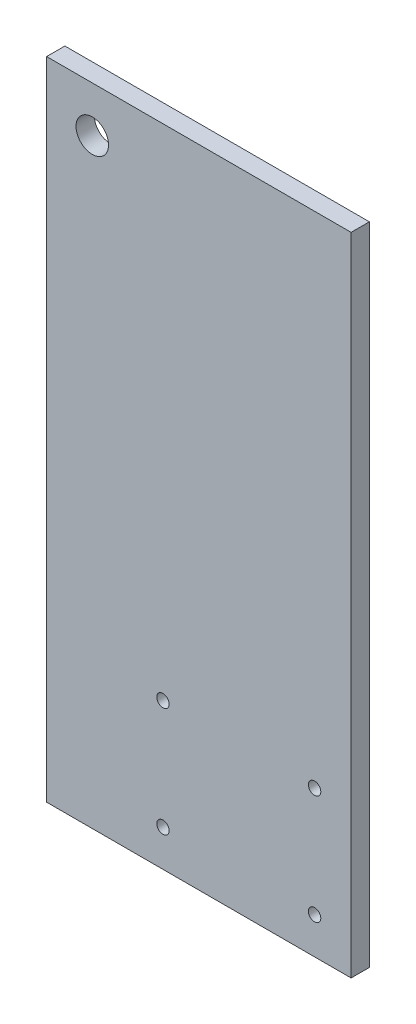
ISO-10303-21;
HEADER;
FILE_DESCRIPTION(('STEP AP214'),'2;1');
FILE_NAME('part.step','',(''),(''),'','','');
FILE_SCHEMA(('AUTOMOTIVE_DESIGN { 1 0 10303 214 1 1 1 1 }'));
ENDSEC;
DATA;
#1=APPLICATION_CONTEXT('core data for automotive mechanical design processes');
#2=APPLICATION_PROTOCOL_DEFINITION('international standard','automotive_design',2000,#1);
#3=PRODUCT_CONTEXT('',#1,'mechanical');
#4=PRODUCT('Part','Part','',(#3));
#5=PRODUCT_RELATED_PRODUCT_CATEGORY('part','',(#4));
#6=PRODUCT_DEFINITION_FORMATION('','',#4);
#7=PRODUCT_DEFINITION_CONTEXT('part definition',#1,'design');
#8=PRODUCT_DEFINITION('design','',#6,#7);
#9=PRODUCT_DEFINITION_SHAPE('','',#8);
#10=(LENGTH_UNIT() NAMED_UNIT(*) SI_UNIT(.MILLI.,.METRE.));
#11=(NAMED_UNIT(*) PLANE_ANGLE_UNIT() SI_UNIT($,.RADIAN.));
#12=(NAMED_UNIT(*) SI_UNIT($,.STERADIAN.) SOLID_ANGLE_UNIT());
#13=UNCERTAINTY_MEASURE_WITH_UNIT(LENGTH_MEASURE(1.E-05),#10,'distance_accuracy_value','');
#14=(GEOMETRIC_REPRESENTATION_CONTEXT(3) GLOBAL_UNCERTAINTY_ASSIGNED_CONTEXT((#13)) GLOBAL_UNIT_ASSIGNED_CONTEXT((#10,
#11,#12)) REPRESENTATION_CONTEXT('',''));
#15=CARTESIAN_POINT('',(0.,0.,0.));
#16=DIRECTION('',(0.,0.,1.));
#17=DIRECTION('',(1.,0.,0.));
#18=AXIS2_PLACEMENT_3D('',#15,#16,#17);
#19=CARTESIAN_POINT('',(0.,0.,800.));
#20=DIRECTION('',(0.,0.,-1.));
#21=DIRECTION('',(-1.,0.,0.));
#22=AXIS2_PLACEMENT_3D('',#19,#20,#21);
#23=PLANE('',#22);
#24=DIRECTION('',(1.,0.,0.));
#25=VECTOR('',#24,1.);
#26=CARTESIAN_POINT('',(-840.,333.498888916653,800.));
#27=LINE('',#26,#25);
#28=CARTESIAN_POINT('',(-673.314428397134,333.498888916653,800.));
#29=VERTEX_POINT('',#28);
#30=CARTESIAN_POINT('',(-840.,333.498888916653,800.));
#31=VERTEX_POINT('',#30);
#32=EDGE_CURVE('E93',#29,#31,#27,.F.);
#33=ORIENTED_EDGE('',*,*,#32,.T.);
#34=DIRECTION('',(0.,1.,0.));
#35=VECTOR('',#34,1.);
#36=CARTESIAN_POINT('',(-840.,687.,800.));
#37=LINE('',#36,#35);
#38=CARTESIAN_POINT('',(-840.,687.,800.));
#39=VERTEX_POINT('',#38);
#40=EDGE_CURVE('E91',#31,#39,#37,.T.);
#41=ORIENTED_EDGE('',*,*,#40,.T.);
#42=DIRECTION('',(1.,0.,0.));
#43=VECTOR('',#42,1.);
#44=CARTESIAN_POINT('',(-840.,687.,800.));
#45=LINE('',#44,#43);
#46=CARTESIAN_POINT('',(-673.314428397134,687.,800.));
#47=VERTEX_POINT('',#46);
#48=EDGE_CURVE('E88',#39,#47,#45,.T.);
#49=ORIENTED_EDGE('',*,*,#48,.T.);
#50=DIRECTION('',(0.,1.,0.));
#51=VECTOR('',#50,1.);
#52=CARTESIAN_POINT('',(-673.314428397134,687.,800.));
#53=LINE('',#52,#51);
#54=EDGE_CURVE('E276',#47,#29,#53,.F.);
#55=ORIENTED_EDGE('',*,*,#54,.T.);
#56=EDGE_LOOP('',(#33,#41,#49,#55));
#57=FACE_BOUND('',#56,.T.);
#58=CARTESIAN_POINT('',(-693.314428397134,353.498888916653,800.));
#59=DIRECTION('',(0.,0.,1.));
#60=DIRECTION('',(1.,0.,0.));
#61=AXIS2_PLACEMENT_3D('',#58,#59,#60);
#62=CIRCLE('',#61,3.39999999999996);
#63=CARTESIAN_POINT('',(-689.914428397134,353.498888916653,800.));
#64=VERTEX_POINT('',#63);
#65=EDGE_CURVE('E99',#64,#64,#62,.T.);
#66=ORIENTED_EDGE('',*,*,#65,.T.);
#67=EDGE_LOOP('',(#66));
#68=FACE_BOUND('',#67,.T.);
#69=CARTESIAN_POINT('',(-776.314428397134,353.498888916653,800.));
#70=DIRECTION('',(0.,0.,1.));
#71=DIRECTION('',(1.,0.,0.));
#72=AXIS2_PLACEMENT_3D('',#69,#70,#71);
#73=CIRCLE('',#72,3.39999999999996);
#74=CARTESIAN_POINT('',(-772.914428397134,353.498888916653,800.));
#75=VERTEX_POINT('',#74);
#76=EDGE_CURVE('E127',#75,#75,#73,.T.);
#77=ORIENTED_EDGE('',*,*,#76,.T.);
#78=EDGE_LOOP('',(#77));
#79=FACE_BOUND('',#78,.T.);
#80=CARTESIAN_POINT('',(-693.314428397134,413.498888916653,800.));
#81=DIRECTION('',(0.,0.,1.));
#82=DIRECTION('',(1.,0.,0.));
#83=AXIS2_PLACEMENT_3D('',#80,#81,#82);
#84=CIRCLE('',#83,3.39999999999996);
#85=CARTESIAN_POINT('',(-689.914428397134,413.498888916653,800.));
#86=VERTEX_POINT('',#85);
#87=EDGE_CURVE('E128',#86,#86,#84,.T.);
#88=ORIENTED_EDGE('',*,*,#87,.T.);
#89=EDGE_LOOP('',(#88));
#90=FACE_BOUND('',#89,.T.);
#91=CARTESIAN_POINT('',(-776.314428397134,413.498888916653,800.));
#92=DIRECTION('',(0.,0.,1.));
#93=DIRECTION('',(1.,0.,0.));
#94=AXIS2_PLACEMENT_3D('',#91,#92,#93);
#95=CIRCLE('',#94,3.39999999999996);
#96=CARTESIAN_POINT('',(-772.914428397134,413.498888916653,800.));
#97=VERTEX_POINT('',#96);
#98=EDGE_CURVE('E131',#97,#97,#95,.T.);
#99=ORIENTED_EDGE('',*,*,#98,.T.);
#100=EDGE_LOOP('',(#99));
#101=FACE_BOUND('',#100,.T.);
#102=CARTESIAN_POINT('',(-815.,662.,800.));
#103=DIRECTION('',(0.,0.,1.));
#104=DIRECTION('',(1.,0.,0.));
#105=AXIS2_PLACEMENT_3D('',#102,#103,#104);
#106=CIRCLE('',#105,8.90000000000002);
#107=CARTESIAN_POINT('',(-806.1,662.,800.));
#108=VERTEX_POINT('',#107);
#109=EDGE_CURVE('E132',#108,#108,#106,.T.);
#110=ORIENTED_EDGE('',*,*,#109,.T.);
#111=EDGE_LOOP('',(#110));
#112=FACE_BOUND('',#111,.T.);
#113=ADVANCED_FACE('F42',(#57,#68,#79,#90,#101,#112),#23,.T.);
#114=CARTESIAN_POINT('',(-815.,662.,770.));
#115=DIRECTION('',(0.,0.,1.));
#116=DIRECTION('',(1.,0.,0.));
#117=AXIS2_PLACEMENT_3D('',#114,#115,#116);
#118=CYLINDRICAL_SURFACE('',#117,8.90000000000002);
#119=ORIENTED_EDGE('',*,*,#109,.F.);
#120=EDGE_LOOP('',(#119));
#121=FACE_BOUND('',#120,.T.);
#122=CARTESIAN_POINT('',(-815.,662.,810.));
#123=DIRECTION('',(0.,0.,1.));
#124=DIRECTION('',(1.,0.,0.));
#125=AXIS2_PLACEMENT_3D('',#122,#123,#124);
#126=CIRCLE('',#125,8.90000000000002);
#127=CARTESIAN_POINT('',(-806.1,662.,810.));
#128=VERTEX_POINT('',#127);
#129=EDGE_CURVE('E121',#128,#128,#126,.T.);
#130=ORIENTED_EDGE('',*,*,#129,.T.);
#131=EDGE_LOOP('',(#130));
#132=FACE_BOUND('',#131,.T.);
#133=ADVANCED_FACE('F146',(#121,#132),#118,.F.);
#134=CARTESIAN_POINT('',(-776.314428397134,413.498888916653,770.));
#135=DIRECTION('',(0.,0.,1.));
#136=DIRECTION('',(1.,0.,0.));
#137=AXIS2_PLACEMENT_3D('',#134,#135,#136);
#138=CYLINDRICAL_SURFACE('',#137,3.39999999999996);
#139=ORIENTED_EDGE('',*,*,#98,.F.);
#140=EDGE_LOOP('',(#139));
#141=FACE_BOUND('',#140,.T.);
#142=CARTESIAN_POINT('',(-776.314428397134,413.498888916653,810.));
#143=DIRECTION('',(0.,0.,1.));
#144=DIRECTION('',(1.,0.,0.));
#145=AXIS2_PLACEMENT_3D('',#142,#143,#144);
#146=CIRCLE('',#145,3.39999999999996);
#147=CARTESIAN_POINT('',(-772.914428397134,413.498888916653,810.));
#148=VERTEX_POINT('',#147);
#149=EDGE_CURVE('E46',#148,#148,#146,.T.);
#150=ORIENTED_EDGE('',*,*,#149,.T.);
#151=EDGE_LOOP('',(#150));
#152=FACE_BOUND('',#151,.T.);
#153=ADVANCED_FACE('F44',(#141,#152),#138,.F.);
#154=CARTESIAN_POINT('',(-693.314428397134,413.498888916653,770.));
#155=DIRECTION('',(0.,0.,1.));
#156=DIRECTION('',(1.,0.,0.));
#157=AXIS2_PLACEMENT_3D('',#154,#155,#156);
#158=CYLINDRICAL_SURFACE('',#157,3.39999999999996);
#159=ORIENTED_EDGE('',*,*,#87,.F.);
#160=EDGE_LOOP('',(#159));
#161=FACE_BOUND('',#160,.T.);
#162=CARTESIAN_POINT('',(-693.314428397134,413.498888916653,810.));
#163=DIRECTION('',(0.,0.,1.));
#164=DIRECTION('',(1.,0.,0.));
#165=AXIS2_PLACEMENT_3D('',#162,#163,#164);
#166=CIRCLE('',#165,3.39999999999996);
#167=CARTESIAN_POINT('',(-689.914428397134,413.498888916653,810.));
#168=VERTEX_POINT('',#167);
#169=EDGE_CURVE('E118',#168,#168,#166,.T.);
#170=ORIENTED_EDGE('',*,*,#169,.T.);
#171=EDGE_LOOP('',(#170));
#172=FACE_BOUND('',#171,.T.);
#173=ADVANCED_FACE('F145',(#161,#172),#158,.F.);
#174=CARTESIAN_POINT('',(-776.314428397134,353.498888916653,770.));
#175=DIRECTION('',(0.,0.,1.));
#176=DIRECTION('',(1.,0.,0.));
#177=AXIS2_PLACEMENT_3D('',#174,#175,#176);
#178=CYLINDRICAL_SURFACE('',#177,3.39999999999996);
#179=ORIENTED_EDGE('',*,*,#76,.F.);
#180=EDGE_LOOP('',(#179));
#181=FACE_BOUND('',#180,.T.);
#182=CARTESIAN_POINT('',(-776.314428397134,353.498888916653,810.));
#183=DIRECTION('',(0.,0.,1.));
#184=DIRECTION('',(1.,0.,0.));
#185=AXIS2_PLACEMENT_3D('',#182,#183,#184);
#186=CIRCLE('',#185,3.39999999999996);
#187=CARTESIAN_POINT('',(-772.914428397134,353.498888916653,810.));
#188=VERTEX_POINT('',#187);
#189=EDGE_CURVE('E117',#188,#188,#186,.T.);
#190=ORIENTED_EDGE('',*,*,#189,.T.);
#191=EDGE_LOOP('',(#190));
#192=FACE_BOUND('',#191,.T.);
#193=ADVANCED_FACE('F168',(#181,#192),#178,.F.);
#194=CARTESIAN_POINT('',(-693.314428397134,353.498888916653,770.));
#195=DIRECTION('',(0.,0.,1.));
#196=DIRECTION('',(1.,0.,0.));
#197=AXIS2_PLACEMENT_3D('',#194,#195,#196);
#198=CYLINDRICAL_SURFACE('',#197,3.39999999999996);
#199=ORIENTED_EDGE('',*,*,#65,.F.);
#200=EDGE_LOOP('',(#199));
#201=FACE_BOUND('',#200,.T.);
#202=CARTESIAN_POINT('',(-693.314428397134,353.498888916653,810.));
#203=DIRECTION('',(0.,0.,1.));
#204=DIRECTION('',(1.,0.,0.));
#205=AXIS2_PLACEMENT_3D('',#202,#203,#204);
#206=CIRCLE('',#205,3.39999999999996);
#207=CARTESIAN_POINT('',(-689.914428397134,353.498888916653,810.));
#208=VERTEX_POINT('',#207);
#209=EDGE_CURVE('E114',#208,#208,#206,.T.);
#210=ORIENTED_EDGE('',*,*,#209,.T.);
#211=EDGE_LOOP('',(#210));
#212=FACE_BOUND('',#211,.T.);
#213=ADVANCED_FACE('F170',(#201,#212),#198,.F.);
#214=CARTESIAN_POINT('',(-840.,687.,810.));
#215=DIRECTION('',(1.,0.,0.));
#216=DIRECTION('',(0.,0.,-1.));
#217=AXIS2_PLACEMENT_3D('',#214,#215,#216);
#218=PLANE('',#217);
#219=DIRECTION('',(0.,0.,-1.));
#220=VECTOR('',#219,1.);
#221=CARTESIAN_POINT('',(-840.,687.,810.));
#222=LINE('',#221,#220);
#223=CARTESIAN_POINT('',(-840.,687.,810.));
#224=VERTEX_POINT('',#223);
#225=EDGE_CURVE('E98',#224,#39,#222,.T.);
#226=ORIENTED_EDGE('',*,*,#225,.T.);
#227=ORIENTED_EDGE('',*,*,#40,.F.);
#228=DIRECTION('',(0.,0.,1.));
#229=VECTOR('',#228,1.);
#230=CARTESIAN_POINT('',(-840.,333.498888916653,810.));
#231=LINE('',#230,#229);
#232=CARTESIAN_POINT('',(-840.,333.498888916653,810.));
#233=VERTEX_POINT('',#232);
#234=EDGE_CURVE('E124',#31,#233,#231,.T.);
#235=ORIENTED_EDGE('',*,*,#234,.T.);
#236=DIRECTION('',(0.,1.,0.));
#237=VECTOR('',#236,1.);
#238=CARTESIAN_POINT('',(-840.,0.,810.));
#239=LINE('',#238,#237);
#240=EDGE_CURVE('E110',#233,#224,#239,.T.);
#241=ORIENTED_EDGE('',*,*,#240,.T.);
#242=EDGE_LOOP('',(#226,#227,#235,#241));
#243=FACE_BOUND('',#242,.T.);
#244=ADVANCED_FACE('F109',(#243),#218,.F.);
#245=CARTESIAN_POINT('',(-840.,687.,810.));
#246=DIRECTION('',(0.,-1.,0.));
#247=DIRECTION('',(0.,0.,-1.));
#248=AXIS2_PLACEMENT_3D('',#245,#246,#247);
#249=PLANE('',#248);
#250=DIRECTION('',(0.,0.,1.));
#251=VECTOR('',#250,1.);
#252=CARTESIAN_POINT('',(-673.314428397134,687.,810.));
#253=LINE('',#252,#251);
#254=CARTESIAN_POINT('',(-673.314428397134,687.,810.));
#255=VERTEX_POINT('',#254);
#256=EDGE_CURVE('E106',#255,#47,#253,.F.);
#257=ORIENTED_EDGE('',*,*,#256,.T.);
#258=ORIENTED_EDGE('',*,*,#48,.F.);
#259=ORIENTED_EDGE('',*,*,#225,.F.);
#260=DIRECTION('',(-1.,0.,0.));
#261=VECTOR('',#260,1.);
#262=CARTESIAN_POINT('',(0.,687.,810.));
#263=LINE('',#262,#261);
#264=EDGE_CURVE('E284',#224,#255,#263,.F.);
#265=ORIENTED_EDGE('',*,*,#264,.T.);
#266=EDGE_LOOP('',(#257,#258,#259,#265));
#267=FACE_BOUND('',#266,.T.);
#268=ADVANCED_FACE('F103',(#267),#249,.F.);
#269=CARTESIAN_POINT('',(-673.314428397134,687.,810.));
#270=DIRECTION('',(-1.,0.,0.));
#271=DIRECTION('',(0.,0.,1.));
#272=AXIS2_PLACEMENT_3D('',#269,#270,#271);
#273=PLANE('',#272);
#274=DIRECTION('',(0.,0.,1.));
#275=VECTOR('',#274,1.);
#276=CARTESIAN_POINT('',(-673.314428397134,333.498888916653,810.));
#277=LINE('',#276,#275);
#278=CARTESIAN_POINT('',(-673.314428397134,333.498888916653,810.));
#279=VERTEX_POINT('',#278);
#280=EDGE_CURVE('E64',#279,#29,#277,.F.);
#281=ORIENTED_EDGE('',*,*,#280,.T.);
#282=ORIENTED_EDGE('',*,*,#54,.F.);
#283=ORIENTED_EDGE('',*,*,#256,.F.);
#284=DIRECTION('',(0.,1.,0.));
#285=VECTOR('',#284,1.);
#286=CARTESIAN_POINT('',(-673.314428397134,0.,810.));
#287=LINE('',#286,#285);
#288=EDGE_CURVE('E52',#255,#279,#287,.F.);
#289=ORIENTED_EDGE('',*,*,#288,.T.);
#290=EDGE_LOOP('',(#281,#282,#283,#289));
#291=FACE_BOUND('',#290,.T.);
#292=ADVANCED_FACE('F216',(#291),#273,.F.);
#293=CARTESIAN_POINT('',(-840.,333.498888916653,810.));
#294=DIRECTION('',(0.,1.,0.));
#295=DIRECTION('',(0.,0.,1.));
#296=AXIS2_PLACEMENT_3D('',#293,#294,#295);
#297=PLANE('',#296);
#298=ORIENTED_EDGE('',*,*,#234,.F.);
#299=ORIENTED_EDGE('',*,*,#32,.F.);
#300=ORIENTED_EDGE('',*,*,#280,.F.);
#301=DIRECTION('',(-1.,0.,0.));
#302=VECTOR('',#301,1.);
#303=CARTESIAN_POINT('',(0.,333.498888916653,810.));
#304=LINE('',#303,#302);
#305=EDGE_CURVE('E11',#279,#233,#304,.T.);
#306=ORIENTED_EDGE('',*,*,#305,.T.);
#307=EDGE_LOOP('',(#298,#299,#300,#306));
#308=FACE_BOUND('',#307,.T.);
#309=ADVANCED_FACE('F153',(#308),#297,.F.);
#310=CARTESIAN_POINT('',(0.,0.,810.));
#311=DIRECTION('',(0.,0.,-1.));
#312=DIRECTION('',(-1.,0.,0.));
#313=AXIS2_PLACEMENT_3D('',#310,#311,#312);
#314=PLANE('',#313);
#315=ORIENTED_EDGE('',*,*,#288,.F.);
#316=ORIENTED_EDGE('',*,*,#264,.F.);
#317=ORIENTED_EDGE('',*,*,#240,.F.);
#318=ORIENTED_EDGE('',*,*,#305,.F.);
#319=EDGE_LOOP('',(#315,#316,#317,#318));
#320=FACE_BOUND('',#319,.T.);
#321=ORIENTED_EDGE('',*,*,#209,.F.);
#322=EDGE_LOOP('',(#321));
#323=FACE_BOUND('',#322,.T.);
#324=ORIENTED_EDGE('',*,*,#189,.F.);
#325=EDGE_LOOP('',(#324));
#326=FACE_BOUND('',#325,.T.);
#327=ORIENTED_EDGE('',*,*,#169,.F.);
#328=EDGE_LOOP('',(#327));
#329=FACE_BOUND('',#328,.T.);
#330=ORIENTED_EDGE('',*,*,#149,.F.);
#331=EDGE_LOOP('',(#330));
#332=FACE_BOUND('',#331,.T.);
#333=ORIENTED_EDGE('',*,*,#129,.F.);
#334=EDGE_LOOP('',(#333));
#335=FACE_BOUND('',#334,.T.);
#336=ADVANCED_FACE('F150',(#320,#323,#326,#329,#332,#335),#314,.F.);
#337=CLOSED_SHELL('',(#113,#133,#153,#173,#193,#213,#244,#268,#292,#309,#336));
#338=MANIFOLD_SOLID_BREP('B2',#337);
#339=ADVANCED_BREP_SHAPE_REPRESENTATION('',(#18,#338),#14);
#340=SHAPE_DEFINITION_REPRESENTATION(#9,#339);
ENDSEC;
END-ISO-10303-21;
